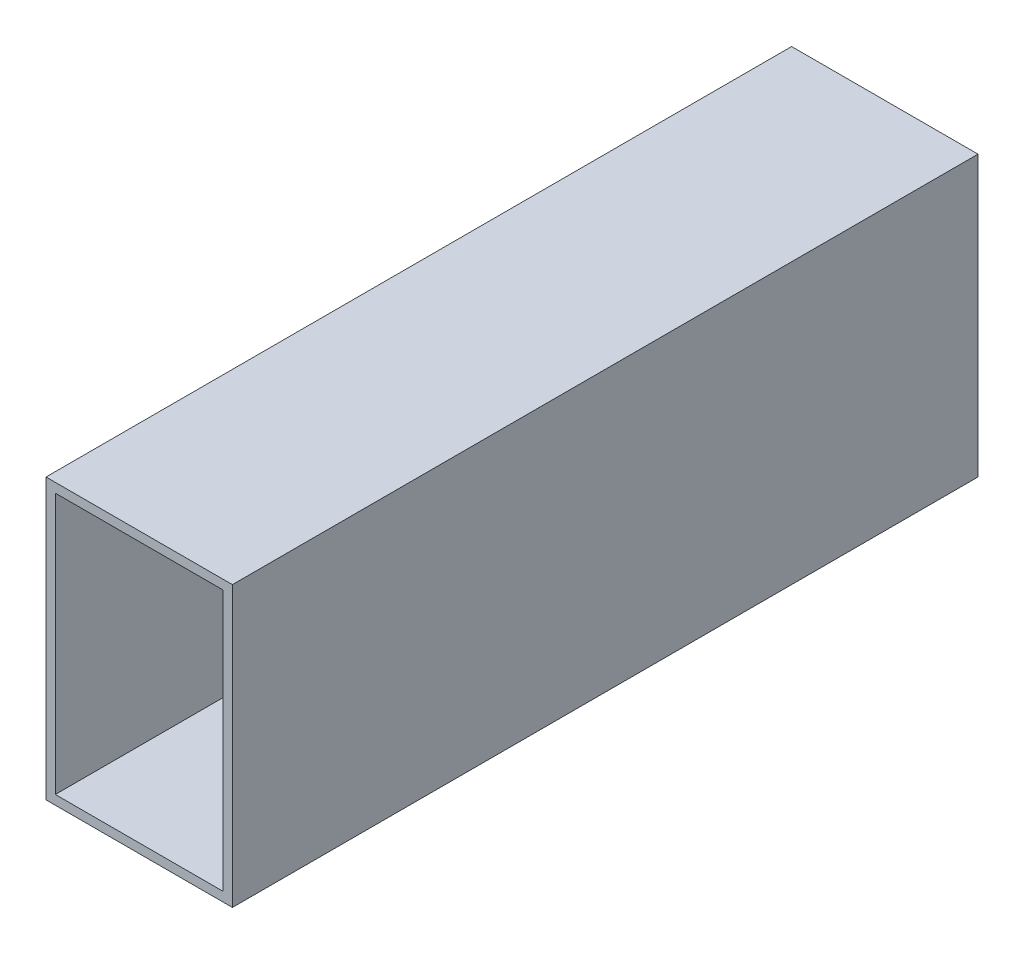
ISO-10303-21;
HEADER;
FILE_DESCRIPTION(('STEP AP214'),'2;1');
FILE_NAME('part.step','',(''),(''),'','','');
FILE_SCHEMA(('AUTOMOTIVE_DESIGN { 1 0 10303 214 1 1 1 1 }'));
ENDSEC;
DATA;
#1=APPLICATION_CONTEXT('core data for automotive mechanical design processes');
#2=APPLICATION_PROTOCOL_DEFINITION('international standard','automotive_design',2000,#1);
#3=PRODUCT_CONTEXT('',#1,'mechanical');
#4=PRODUCT('Part','Part','',(#3));
#5=PRODUCT_RELATED_PRODUCT_CATEGORY('part','',(#4));
#6=PRODUCT_DEFINITION_FORMATION('','',#4);
#7=PRODUCT_DEFINITION_CONTEXT('part definition',#1,'design');
#8=PRODUCT_DEFINITION('design','',#6,#7);
#9=PRODUCT_DEFINITION_SHAPE('','',#8);
#10=(LENGTH_UNIT() NAMED_UNIT(*) SI_UNIT(.MILLI.,.METRE.));
#11=(NAMED_UNIT(*) PLANE_ANGLE_UNIT() SI_UNIT($,.RADIAN.));
#12=(NAMED_UNIT(*) SI_UNIT($,.STERADIAN.) SOLID_ANGLE_UNIT());
#13=UNCERTAINTY_MEASURE_WITH_UNIT(LENGTH_MEASURE(1.E-05),#10,'distance_accuracy_value','');
#14=(GEOMETRIC_REPRESENTATION_CONTEXT(3) GLOBAL_UNCERTAINTY_ASSIGNED_CONTEXT((#13)) GLOBAL_UNIT_ASSIGNED_CONTEXT((#10,
#11,#12)) REPRESENTATION_CONTEXT('',''));
#15=CARTESIAN_POINT('',(0.,0.,0.));
#16=DIRECTION('',(0.,0.,1.));
#17=DIRECTION('',(1.,0.,0.));
#18=AXIS2_PLACEMENT_3D('',#15,#16,#17);
#19=CARTESIAN_POINT('',(40.,60.,160.));
#20=DIRECTION('',(0.,0.,-1.));
#21=DIRECTION('',(-1.,0.,0.));
#22=AXIS2_PLACEMENT_3D('',#19,#20,#21);
#23=PLANE('',#22);
#24=DIRECTION('',(0.,-1.,0.));
#25=VECTOR('',#24,1.);
#26=CARTESIAN_POINT('',(-40.,60.,160.));
#27=LINE('',#26,#25);
#28=CARTESIAN_POINT('',(-40.,60.,160.));
#29=VERTEX_POINT('',#28);
#30=CARTESIAN_POINT('',(-40.,-60.,160.));
#31=VERTEX_POINT('',#30);
#32=EDGE_CURVE('E126',#29,#31,#27,.T.);
#33=ORIENTED_EDGE('',*,*,#32,.T.);
#34=DIRECTION('',(-1.,0.,0.));
#35=VECTOR('',#34,1.);
#36=CARTESIAN_POINT('',(40.,-60.,160.));
#37=LINE('',#36,#35);
#38=CARTESIAN_POINT('',(40.,-60.,160.));
#39=VERTEX_POINT('',#38);
#40=EDGE_CURVE('E11',#39,#31,#37,.T.);
#41=ORIENTED_EDGE('',*,*,#40,.F.);
#42=DIRECTION('',(0.,-1.,0.));
#43=VECTOR('',#42,1.);
#44=CARTESIAN_POINT('',(40.,60.,160.));
#45=LINE('',#44,#43);
#46=CARTESIAN_POINT('',(40.,60.,160.));
#47=VERTEX_POINT('',#46);
#48=EDGE_CURVE('E131',#47,#39,#45,.T.);
#49=ORIENTED_EDGE('',*,*,#48,.F.);
#50=DIRECTION('',(-1.,0.,0.));
#51=VECTOR('',#50,1.);
#52=CARTESIAN_POINT('',(40.,60.,160.));
#53=LINE('',#52,#51);
#54=EDGE_CURVE('E141',#47,#29,#53,.T.);
#55=ORIENTED_EDGE('',*,*,#54,.T.);
#56=EDGE_LOOP('',(#33,#41,#49,#55));
#57=FACE_BOUND('',#56,.T.);
#58=DIRECTION('',(0.,-1.,0.));
#59=VECTOR('',#58,1.);
#60=CARTESIAN_POINT('',(-36.,60.,160.));
#61=LINE('',#60,#59);
#62=CARTESIAN_POINT('',(-36.,56.,160.));
#63=VERTEX_POINT('',#62);
#64=CARTESIAN_POINT('',(-36.,-56.,160.));
#65=VERTEX_POINT('',#64);
#66=EDGE_CURVE('E102',#63,#65,#61,.T.);
#67=ORIENTED_EDGE('',*,*,#66,.F.);
#68=DIRECTION('',(-1.,0.,0.));
#69=VECTOR('',#68,1.);
#70=CARTESIAN_POINT('',(40.,56.,160.));
#71=LINE('',#70,#69);
#72=CARTESIAN_POINT('',(36.,56.,160.));
#73=VERTEX_POINT('',#72);
#74=EDGE_CURVE('E122',#73,#63,#71,.T.);
#75=ORIENTED_EDGE('',*,*,#74,.F.);
#76=DIRECTION('',(0.,-1.,0.));
#77=VECTOR('',#76,1.);
#78=CARTESIAN_POINT('',(36.,60.,160.));
#79=LINE('',#78,#77);
#80=CARTESIAN_POINT('',(36.,-56.,160.));
#81=VERTEX_POINT('',#80);
#82=EDGE_CURVE('E46',#73,#81,#79,.T.);
#83=ORIENTED_EDGE('',*,*,#82,.T.);
#84=DIRECTION('',(-1.,0.,0.));
#85=VECTOR('',#84,1.);
#86=CARTESIAN_POINT('',(40.,-56.,160.));
#87=LINE('',#86,#85);
#88=EDGE_CURVE('E112',#81,#65,#87,.T.);
#89=ORIENTED_EDGE('',*,*,#88,.T.);
#90=EDGE_LOOP('',(#67,#75,#83,#89));
#91=FACE_BOUND('',#90,.T.);
#92=ADVANCED_FACE('F32',(#57,#91),#23,.F.);
#93=CARTESIAN_POINT('',(40.,60.,-160.));
#94=DIRECTION('',(0.,0.,1.));
#95=DIRECTION('',(1.,0.,0.));
#96=AXIS2_PLACEMENT_3D('',#93,#94,#95);
#97=PLANE('',#96);
#98=DIRECTION('',(0.,1.,0.));
#99=VECTOR('',#98,1.);
#100=CARTESIAN_POINT('',(-40.,60.,-160.));
#101=LINE('',#100,#99);
#102=CARTESIAN_POINT('',(-40.,-60.,-160.));
#103=VERTEX_POINT('',#102);
#104=CARTESIAN_POINT('',(-40.,60.,-160.));
#105=VERTEX_POINT('',#104);
#106=EDGE_CURVE('E146',#103,#105,#101,.T.);
#107=ORIENTED_EDGE('',*,*,#106,.T.);
#108=DIRECTION('',(-1.,0.,0.));
#109=VECTOR('',#108,1.);
#110=CARTESIAN_POINT('',(40.,60.,-160.));
#111=LINE('',#110,#109);
#112=CARTESIAN_POINT('',(40.,60.,-160.));
#113=VERTEX_POINT('',#112);
#114=EDGE_CURVE('E151',#113,#105,#111,.T.);
#115=ORIENTED_EDGE('',*,*,#114,.F.);
#116=DIRECTION('',(0.,1.,0.));
#117=VECTOR('',#116,1.);
#118=CARTESIAN_POINT('',(40.,60.,-160.));
#119=LINE('',#118,#117);
#120=CARTESIAN_POINT('',(40.,-60.,-160.));
#121=VERTEX_POINT('',#120);
#122=EDGE_CURVE('E137',#121,#113,#119,.T.);
#123=ORIENTED_EDGE('',*,*,#122,.F.);
#124=DIRECTION('',(-1.,0.,0.));
#125=VECTOR('',#124,1.);
#126=CARTESIAN_POINT('',(40.,-60.,-160.));
#127=LINE('',#126,#125);
#128=EDGE_CURVE('E39',#121,#103,#127,.T.);
#129=ORIENTED_EDGE('',*,*,#128,.T.);
#130=EDGE_LOOP('',(#107,#115,#123,#129));
#131=FACE_BOUND('',#130,.T.);
#132=DIRECTION('',(0.,1.,0.));
#133=VECTOR('',#132,1.);
#134=CARTESIAN_POINT('',(-36.,60.,-160.));
#135=LINE('',#134,#133);
#136=CARTESIAN_POINT('',(-36.,-56.,-160.));
#137=VERTEX_POINT('',#136);
#138=CARTESIAN_POINT('',(-36.,56.,-160.));
#139=VERTEX_POINT('',#138);
#140=EDGE_CURVE('E99',#137,#139,#135,.T.);
#141=ORIENTED_EDGE('',*,*,#140,.F.);
#142=DIRECTION('',(-1.,0.,0.));
#143=VECTOR('',#142,1.);
#144=CARTESIAN_POINT('',(40.,-56.,-160.));
#145=LINE('',#144,#143);
#146=CARTESIAN_POINT('',(36.,-56.,-160.));
#147=VERTEX_POINT('',#146);
#148=EDGE_CURVE('E108',#147,#137,#145,.T.);
#149=ORIENTED_EDGE('',*,*,#148,.F.);
#150=DIRECTION('',(0.,1.,0.));
#151=VECTOR('',#150,1.);
#152=CARTESIAN_POINT('',(36.,60.,-160.));
#153=LINE('',#152,#151);
#154=CARTESIAN_POINT('',(36.,56.,-160.));
#155=VERTEX_POINT('',#154);
#156=EDGE_CURVE('E51',#147,#155,#153,.T.);
#157=ORIENTED_EDGE('',*,*,#156,.T.);
#158=DIRECTION('',(-1.,0.,0.));
#159=VECTOR('',#158,1.);
#160=CARTESIAN_POINT('',(40.,56.,-160.));
#161=LINE('',#160,#159);
#162=EDGE_CURVE('E113',#155,#139,#161,.T.);
#163=ORIENTED_EDGE('',*,*,#162,.T.);
#164=EDGE_LOOP('',(#141,#149,#157,#163));
#165=FACE_BOUND('',#164,.T.);
#166=ADVANCED_FACE('F116',(#131,#165),#97,.F.);
#167=CARTESIAN_POINT('',(40.,-60.,160.));
#168=DIRECTION('',(0.,1.,0.));
#169=DIRECTION('',(0.,0.,1.));
#170=AXIS2_PLACEMENT_3D('',#167,#168,#169);
#171=PLANE('',#170);
#172=DIRECTION('',(0.,0.,-1.));
#173=VECTOR('',#172,1.);
#174=CARTESIAN_POINT('',(-40.,-60.,160.));
#175=LINE('',#174,#173);
#176=EDGE_CURVE('E144',#31,#103,#175,.T.);
#177=ORIENTED_EDGE('',*,*,#176,.T.);
#178=ORIENTED_EDGE('',*,*,#128,.F.);
#179=DIRECTION('',(0.,0.,-1.));
#180=VECTOR('',#179,1.);
#181=CARTESIAN_POINT('',(40.,-60.,160.));
#182=LINE('',#181,#180);
#183=EDGE_CURVE('E134',#39,#121,#182,.T.);
#184=ORIENTED_EDGE('',*,*,#183,.F.);
#185=ORIENTED_EDGE('',*,*,#40,.T.);
#186=EDGE_LOOP('',(#177,#178,#184,#185));
#187=FACE_BOUND('',#186,.T.);
#188=ADVANCED_FACE('F174',(#187),#171,.F.);
#189=CARTESIAN_POINT('',(40.,60.,160.));
#190=DIRECTION('',(0.,-1.,0.));
#191=DIRECTION('',(0.,0.,-1.));
#192=AXIS2_PLACEMENT_3D('',#189,#190,#191);
#193=PLANE('',#192);
#194=DIRECTION('',(0.,0.,1.));
#195=VECTOR('',#194,1.);
#196=CARTESIAN_POINT('',(-40.,60.,160.));
#197=LINE('',#196,#195);
#198=EDGE_CURVE('E135',#105,#29,#197,.T.);
#199=ORIENTED_EDGE('',*,*,#198,.T.);
#200=ORIENTED_EDGE('',*,*,#54,.F.);
#201=DIRECTION('',(0.,0.,1.));
#202=VECTOR('',#201,1.);
#203=CARTESIAN_POINT('',(40.,60.,160.));
#204=LINE('',#203,#202);
#205=EDGE_CURVE('E139',#113,#47,#204,.T.);
#206=ORIENTED_EDGE('',*,*,#205,.F.);
#207=ORIENTED_EDGE('',*,*,#114,.T.);
#208=EDGE_LOOP('',(#199,#200,#206,#207));
#209=FACE_BOUND('',#208,.T.);
#210=ADVANCED_FACE('F166',(#209),#193,.F.);
#211=CARTESIAN_POINT('',(40.,0.,0.));
#212=DIRECTION('',(1.,0.,0.));
#213=DIRECTION('',(0.,0.,-1.));
#214=AXIS2_PLACEMENT_3D('',#211,#212,#213);
#215=PLANE('',#214);
#216=ORIENTED_EDGE('',*,*,#48,.T.);
#217=ORIENTED_EDGE('',*,*,#183,.T.);
#218=ORIENTED_EDGE('',*,*,#122,.T.);
#219=ORIENTED_EDGE('',*,*,#205,.T.);
#220=EDGE_LOOP('',(#216,#217,#218,#219));
#221=FACE_BOUND('',#220,.T.);
#222=ADVANCED_FACE('F173',(#221),#215,.T.);
#223=CARTESIAN_POINT('',(-40.,0.,0.));
#224=DIRECTION('',(1.,0.,0.));
#225=DIRECTION('',(0.,0.,-1.));
#226=AXIS2_PLACEMENT_3D('',#223,#224,#225);
#227=PLANE('',#226);
#228=ORIENTED_EDGE('',*,*,#32,.F.);
#229=ORIENTED_EDGE('',*,*,#198,.F.);
#230=ORIENTED_EDGE('',*,*,#106,.F.);
#231=ORIENTED_EDGE('',*,*,#176,.F.);
#232=EDGE_LOOP('',(#228,#229,#230,#231));
#233=FACE_BOUND('',#232,.T.);
#234=ADVANCED_FACE('F163',(#233),#227,.F.);
#235=CARTESIAN_POINT('',(40.,-56.,160.));
#236=DIRECTION('',(0.,1.,0.));
#237=DIRECTION('',(0.,0.,1.));
#238=AXIS2_PLACEMENT_3D('',#235,#236,#237);
#239=PLANE('',#238);
#240=DIRECTION('',(0.,0.,-1.));
#241=VECTOR('',#240,1.);
#242=CARTESIAN_POINT('',(-36.,-56.,160.));
#243=LINE('',#242,#241);
#244=EDGE_CURVE('E95',#65,#137,#243,.T.);
#245=ORIENTED_EDGE('',*,*,#244,.F.);
#246=ORIENTED_EDGE('',*,*,#88,.F.);
#247=DIRECTION('',(0.,0.,-1.));
#248=VECTOR('',#247,1.);
#249=CARTESIAN_POINT('',(36.,-56.,160.));
#250=LINE('',#249,#248);
#251=EDGE_CURVE('E110',#81,#147,#250,.T.);
#252=ORIENTED_EDGE('',*,*,#251,.T.);
#253=ORIENTED_EDGE('',*,*,#148,.T.);
#254=EDGE_LOOP('',(#245,#246,#252,#253));
#255=FACE_BOUND('',#254,.T.);
#256=ADVANCED_FACE('F109',(#255),#239,.T.);
#257=CARTESIAN_POINT('',(40.,56.,160.));
#258=DIRECTION('',(0.,-1.,0.));
#259=DIRECTION('',(0.,0.,-1.));
#260=AXIS2_PLACEMENT_3D('',#257,#258,#259);
#261=PLANE('',#260);
#262=DIRECTION('',(0.,0.,1.));
#263=VECTOR('',#262,1.);
#264=CARTESIAN_POINT('',(-36.,56.,160.));
#265=LINE('',#264,#263);
#266=EDGE_CURVE('E117',#139,#63,#265,.T.);
#267=ORIENTED_EDGE('',*,*,#266,.F.);
#268=ORIENTED_EDGE('',*,*,#162,.F.);
#269=DIRECTION('',(0.,0.,1.));
#270=VECTOR('',#269,1.);
#271=CARTESIAN_POINT('',(36.,56.,160.));
#272=LINE('',#271,#270);
#273=EDGE_CURVE('E124',#155,#73,#272,.T.);
#274=ORIENTED_EDGE('',*,*,#273,.T.);
#275=ORIENTED_EDGE('',*,*,#74,.T.);
#276=EDGE_LOOP('',(#267,#268,#274,#275));
#277=FACE_BOUND('',#276,.T.);
#278=ADVANCED_FACE('F200',(#277),#261,.T.);
#279=CARTESIAN_POINT('',(36.,0.,0.));
#280=DIRECTION('',(1.,0.,0.));
#281=DIRECTION('',(0.,0.,-1.));
#282=AXIS2_PLACEMENT_3D('',#279,#280,#281);
#283=PLANE('',#282);
#284=ORIENTED_EDGE('',*,*,#82,.F.);
#285=ORIENTED_EDGE('',*,*,#273,.F.);
#286=ORIENTED_EDGE('',*,*,#156,.F.);
#287=ORIENTED_EDGE('',*,*,#251,.F.);
#288=EDGE_LOOP('',(#284,#285,#286,#287));
#289=FACE_BOUND('',#288,.T.);
#290=ADVANCED_FACE('F210',(#289),#283,.F.);
#291=CARTESIAN_POINT('',(-36.,0.,0.));
#292=DIRECTION('',(1.,0.,0.));
#293=DIRECTION('',(0.,0.,-1.));
#294=AXIS2_PLACEMENT_3D('',#291,#292,#293);
#295=PLANE('',#294);
#296=ORIENTED_EDGE('',*,*,#66,.T.);
#297=ORIENTED_EDGE('',*,*,#244,.T.);
#298=ORIENTED_EDGE('',*,*,#140,.T.);
#299=ORIENTED_EDGE('',*,*,#266,.T.);
#300=EDGE_LOOP('',(#296,#297,#298,#299));
#301=FACE_BOUND('',#300,.T.);
#302=ADVANCED_FACE('F97',(#301),#295,.T.);
#303=CLOSED_SHELL('',(#92,#166,#188,#210,#222,#234,#256,#278,#290,#302));
#304=MANIFOLD_SOLID_BREP('B2',#303);
#305=ADVANCED_BREP_SHAPE_REPRESENTATION('',(#18,#304),#14);
#306=SHAPE_DEFINITION_REPRESENTATION(#9,#305);
ENDSEC;
END-ISO-10303-21;
